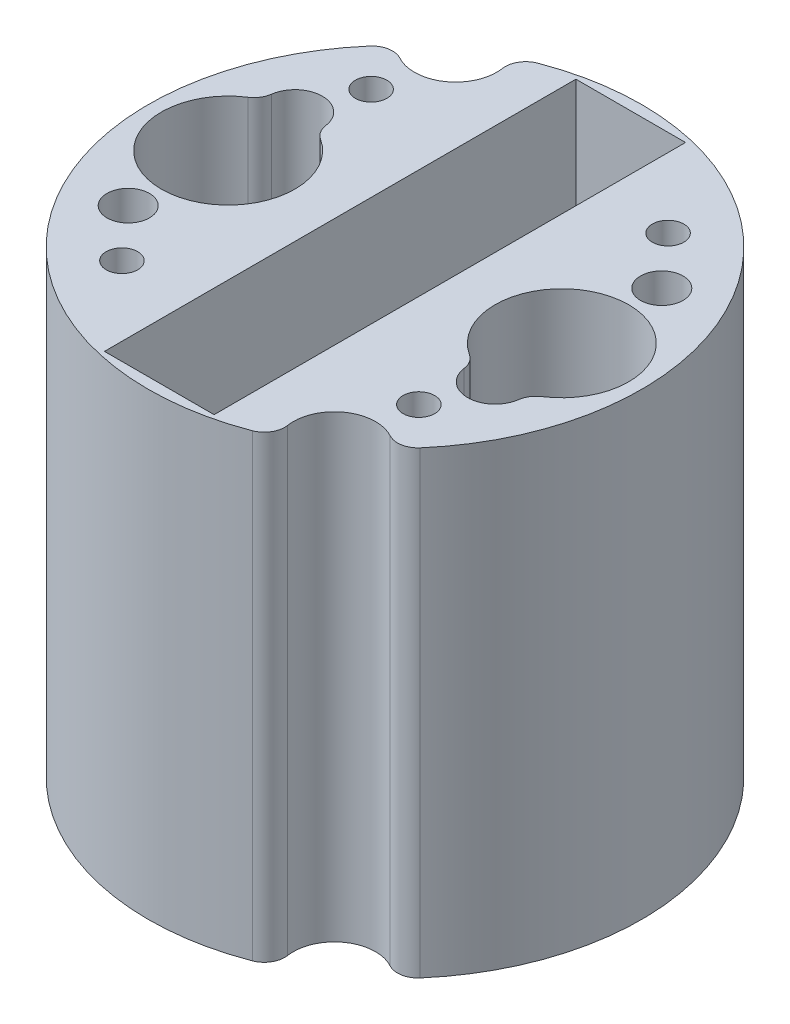
ISO-10303-21;
HEADER;
FILE_DESCRIPTION(('STEP AP214'),'2;1');
FILE_NAME('part.step','',(''),(''),'','','');
FILE_SCHEMA(('AUTOMOTIVE_DESIGN { 1 0 10303 214 1 1 1 1 }'));
ENDSEC;
DATA;
#1=APPLICATION_CONTEXT('core data for automotive mechanical design processes');
#2=APPLICATION_PROTOCOL_DEFINITION('international standard','automotive_design',2000,#1);
#3=PRODUCT_CONTEXT('',#1,'mechanical');
#4=PRODUCT('Part','Part','',(#3));
#5=PRODUCT_RELATED_PRODUCT_CATEGORY('part','',(#4));
#6=PRODUCT_DEFINITION_FORMATION('','',#4);
#7=PRODUCT_DEFINITION_CONTEXT('part definition',#1,'design');
#8=PRODUCT_DEFINITION('design','',#6,#7);
#9=PRODUCT_DEFINITION_SHAPE('','',#8);
#10=(LENGTH_UNIT() NAMED_UNIT(*) SI_UNIT(.MILLI.,.METRE.));
#11=(NAMED_UNIT(*) PLANE_ANGLE_UNIT() SI_UNIT($,.RADIAN.));
#12=(NAMED_UNIT(*) SI_UNIT($,.STERADIAN.) SOLID_ANGLE_UNIT());
#13=UNCERTAINTY_MEASURE_WITH_UNIT(LENGTH_MEASURE(1.E-05),#10,'distance_accuracy_value','');
#14=(GEOMETRIC_REPRESENTATION_CONTEXT(3) GLOBAL_UNCERTAINTY_ASSIGNED_CONTEXT((#13)) GLOBAL_UNIT_ASSIGNED_CONTEXT((#10,
#11,#12)) REPRESENTATION_CONTEXT('',''));
#15=CARTESIAN_POINT('',(0.,0.,0.));
#16=DIRECTION('',(0.,0.,1.));
#17=DIRECTION('',(1.,0.,0.));
#18=AXIS2_PLACEMENT_3D('',#15,#16,#17);
#19=CARTESIAN_POINT('',(0.,64.,0.));
#20=DIRECTION('',(0.,-1.,0.));
#21=DIRECTION('',(0.,0.,-1.));
#22=AXIS2_PLACEMENT_3D('',#19,#20,#21);
#23=CYLINDRICAL_SURFACE('',#22,36.);
#24=CARTESIAN_POINT('',(0.,-3.,0.));
#25=DIRECTION('',(0.,-1.,0.));
#26=DIRECTION('',(0.,0.,-1.));
#27=AXIS2_PLACEMENT_3D('',#24,#25,#26);
#28=CIRCLE('',#27,36.);
#29=CARTESIAN_POINT('',(12.8184338695961,-3.,33.6405670750478));
#30=VERTEX_POINT('',#29);
#31=CARTESIAN_POINT('',(-27.2276300501857,-3.,-23.5511392898566));
#32=VERTEX_POINT('',#31);
#33=EDGE_CURVE('E296',#30,#32,#28,.T.);
#34=ORIENTED_EDGE('',*,*,#33,.F.);
#35=DIRECTION('',(0.,-1.,0.));
#36=VECTOR('',#35,1.);
#37=CARTESIAN_POINT('',(12.8184338695961,64.,33.6405670750478));
#38=LINE('',#37,#36);
#39=CARTESIAN_POINT('',(12.8184338695961,64.,33.6405670750478));
#40=VERTEX_POINT('',#39);
#41=EDGE_CURVE('E11',#30,#40,#38,.F.);
#42=ORIENTED_EDGE('',*,*,#41,.T.);
#43=CARTESIAN_POINT('',(0.,64.,0.));
#44=DIRECTION('',(0.,1.,0.));
#45=DIRECTION('',(0.,0.,1.));
#46=AXIS2_PLACEMENT_3D('',#43,#44,#45);
#47=CIRCLE('',#46,36.);
#48=CARTESIAN_POINT('',(-27.2276300501857,64.,-23.5511392898566));
#49=VERTEX_POINT('',#48);
#50=EDGE_CURVE('E191',#49,#40,#47,.T.);
#51=ORIENTED_EDGE('',*,*,#50,.F.);
#52=DIRECTION('',(0.,-1.,0.));
#53=VECTOR('',#52,1.);
#54=CARTESIAN_POINT('',(-27.2276300501857,64.,-23.5511392898566));
#55=LINE('',#54,#53);
#56=EDGE_CURVE('E350',#49,#32,#55,.T.);
#57=ORIENTED_EDGE('',*,*,#56,.T.);
#58=EDGE_LOOP('',(#34,#42,#51,#57));
#59=FACE_BOUND('',#58,.T.);
#60=ADVANCED_FACE('F41',(#59),#23,.T.);
#61=CARTESIAN_POINT('',(11.7502310471298,-3.,30.8371864854605));
#62=DIRECTION('',(0.,-1.,0.));
#63=DIRECTION('',(0.,0.,1.));
#64=AXIS2_PLACEMENT_3D('',#61,#62,#63);
#65=CYLINDRICAL_SURFACE('',#64,3.);
#66=CARTESIAN_POINT('',(11.7502310471298,-3.,30.8371864854605));
#67=DIRECTION('',(0.,-1.,0.));
#68=DIRECTION('',(0.,0.,1.));
#69=AXIS2_PLACEMENT_3D('',#66,#67,#68);
#70=CIRCLE('',#69,3.);
#71=CARTESIAN_POINT('',(14.7164046009657,-3.,30.3879488551083));
#72=VERTEX_POINT('',#71);
#73=EDGE_CURVE('E388',#72,#30,#70,.T.);
#74=ORIENTED_EDGE('',*,*,#73,.F.);
#75=DIRECTION('',(0.,1.,0.));
#76=VECTOR('',#75,1.);
#77=CARTESIAN_POINT('',(14.7164046009657,-3.,30.3879488551083));
#78=LINE('',#77,#76);
#79=CARTESIAN_POINT('',(14.7164046009657,64.,30.3879488551083));
#80=VERTEX_POINT('',#79);
#81=EDGE_CURVE('E371',#80,#72,#78,.F.);
#82=ORIENTED_EDGE('',*,*,#81,.F.);
#83=CARTESIAN_POINT('',(11.7502310471298,64.,30.8371864854605));
#84=DIRECTION('',(0.,1.,0.));
#85=DIRECTION('',(0.,0.,-1.));
#86=AXIS2_PLACEMENT_3D('',#83,#84,#85);
#87=CIRCLE('',#86,3.);
#88=EDGE_CURVE('E49',#40,#80,#87,.T.);
#89=ORIENTED_EDGE('',*,*,#88,.F.);
#90=ORIENTED_EDGE('',*,*,#41,.F.);
#91=EDGE_LOOP('',(#74,#82,#89,#90));
#92=FACE_BOUND('',#91,.T.);
#93=ADVANCED_FACE('F43',(#92),#65,.T.);
#94=CARTESIAN_POINT('',(24.9586608793369,64.,21.5885443490352));
#95=DIRECTION('',(0.,-1.,0.));
#96=DIRECTION('',(0.,0.,1.));
#97=AXIS2_PLACEMENT_3D('',#94,#95,#96);
#98=CYLINDRICAL_SURFACE('',#97,3.);
#99=CARTESIAN_POINT('',(24.9586608793369,-3.,21.5885443490352));
#100=DIRECTION('',(0.,-1.,0.));
#101=DIRECTION('',(0.,0.,1.));
#102=AXIS2_PLACEMENT_3D('',#99,#100,#101);
#103=CIRCLE('',#102,3.);
#104=CARTESIAN_POINT('',(27.2276300501857,-3.,23.5511392898566));
#105=VERTEX_POINT('',#104);
#106=CARTESIAN_POINT('',(23.5220244891038,-3.,24.2221874308247));
#107=VERTEX_POINT('',#106);
#108=EDGE_CURVE('E379',#105,#107,#103,.T.);
#109=ORIENTED_EDGE('',*,*,#108,.F.);
#110=DIRECTION('',(0.,-1.,0.));
#111=VECTOR('',#110,1.);
#112=CARTESIAN_POINT('',(27.2276300501857,64.,23.5511392898566));
#113=LINE('',#112,#111);
#114=CARTESIAN_POINT('',(27.2276300501857,64.,23.5511392898566));
#115=VERTEX_POINT('',#114);
#116=EDGE_CURVE('E382',#115,#105,#113,.T.);
#117=ORIENTED_EDGE('',*,*,#116,.F.);
#118=CARTESIAN_POINT('',(24.9586608793369,64.,21.5885443490352));
#119=DIRECTION('',(0.,1.,0.));
#120=DIRECTION('',(0.,0.,-1.));
#121=AXIS2_PLACEMENT_3D('',#118,#119,#120);
#122=CIRCLE('',#121,3.);
#123=CARTESIAN_POINT('',(23.5220244891038,64.,24.2221874308247));
#124=VERTEX_POINT('',#123);
#125=EDGE_CURVE('E385',#124,#115,#122,.T.);
#126=ORIENTED_EDGE('',*,*,#125,.F.);
#127=DIRECTION('',(0.,1.,0.));
#128=VECTOR('',#127,1.);
#129=CARTESIAN_POINT('',(23.5220244891038,-3.,24.2221874308247));
#130=LINE('',#129,#128);
#131=EDGE_CURVE('E376',#107,#124,#130,.T.);
#132=ORIENTED_EDGE('',*,*,#131,.F.);
#133=EDGE_LOOP('',(#109,#117,#126,#132));
#134=FACE_BOUND('',#133,.T.);
#135=ADVANCED_FACE('F412',(#134),#98,.T.);
#136=CARTESIAN_POINT('',(20.6487517086375,-3.,29.4894735944038));
#137=DIRECTION('',(0.,1.,0.));
#138=DIRECTION('',(0.,0.,-1.));
#139=AXIS2_PLACEMENT_3D('',#136,#137,#138);
#140=CYLINDRICAL_SURFACE('',#139,6.);
#141=CARTESIAN_POINT('',(20.6487517086375,64.,29.4894735944038));
#142=DIRECTION('',(0.,1.,0.));
#143=DIRECTION('',(0.,0.,-1.));
#144=AXIS2_PLACEMENT_3D('',#141,#142,#143);
#145=CIRCLE('',#144,6.);
#146=EDGE_CURVE('E369',#124,#80,#145,.T.);
#147=ORIENTED_EDGE('',*,*,#146,.T.);
#148=ORIENTED_EDGE('',*,*,#81,.T.);
#149=CARTESIAN_POINT('',(20.6487517086375,-3.,29.4894735944038));
#150=DIRECTION('',(0.,1.,0.));
#151=DIRECTION('',(0.,0.,-1.));
#152=AXIS2_PLACEMENT_3D('',#149,#150,#151);
#153=CIRCLE('',#152,6.);
#154=EDGE_CURVE('E373',#107,#72,#153,.T.);
#155=ORIENTED_EDGE('',*,*,#154,.F.);
#156=ORIENTED_EDGE('',*,*,#131,.T.);
#157=EDGE_LOOP('',(#147,#148,#155,#156));
#158=FACE_BOUND('',#157,.T.);
#159=ADVANCED_FACE('F409',(#158),#140,.F.);
#160=CARTESIAN_POINT('',(0.,64.,0.));
#161=DIRECTION('',(0.,1.,0.));
#162=DIRECTION('',(0.,0.,1.));
#163=AXIS2_PLACEMENT_3D('',#160,#161,#162);
#164=PLANE('',#163);
#165=ORIENTED_EDGE('',*,*,#50,.T.);
#166=ORIENTED_EDGE('',*,*,#88,.T.);
#167=ORIENTED_EDGE('',*,*,#146,.F.);
#168=ORIENTED_EDGE('',*,*,#125,.T.);
#169=CARTESIAN_POINT('',(-12.8184338695961,64.,-33.6405670750478));
#170=VERTEX_POINT('',#169);
#171=EDGE_CURVE('E317',#115,#170,#47,.T.);
#172=ORIENTED_EDGE('',*,*,#171,.T.);
#173=CARTESIAN_POINT('',(-11.7502310471298,64.,-30.8371864854605));
#174=DIRECTION('',(0.,1.,0.));
#175=DIRECTION('',(0.,0.,1.));
#176=AXIS2_PLACEMENT_3D('',#173,#174,#175);
#177=CIRCLE('',#176,3.);
#178=CARTESIAN_POINT('',(-14.7164046009657,64.,-30.3879488551083));
#179=VERTEX_POINT('',#178);
#180=EDGE_CURVE('E330',#170,#179,#177,.T.);
#181=ORIENTED_EDGE('',*,*,#180,.T.);
#182=CARTESIAN_POINT('',(-20.6487517086375,64.,-29.4894735944038));
#183=DIRECTION('',(0.,1.,0.));
#184=DIRECTION('',(0.,0.,1.));
#185=AXIS2_PLACEMENT_3D('',#182,#183,#184);
#186=CIRCLE('',#185,6.);
#187=CARTESIAN_POINT('',(-23.5220244891038,64.,-24.2221874308247));
#188=VERTEX_POINT('',#187);
#189=EDGE_CURVE('E218',#188,#179,#186,.T.);
#190=ORIENTED_EDGE('',*,*,#189,.F.);
#191=CARTESIAN_POINT('',(-24.9586608793369,64.,-21.5885443490352));
#192=DIRECTION('',(0.,1.,0.));
#193=DIRECTION('',(0.,0.,1.));
#194=AXIS2_PLACEMENT_3D('',#191,#192,#193);
#195=CIRCLE('',#194,3.);
#196=EDGE_CURVE('E328',#188,#49,#195,.T.);
#197=ORIENTED_EDGE('',*,*,#196,.T.);
#198=EDGE_LOOP('',(#165,#166,#167,#168,#172,#181,#190,#197));
#199=FACE_BOUND('',#198,.T.);
#200=CARTESIAN_POINT('',(-24.6817240078565,64.,14.25));
#201=DIRECTION('',(0.,1.,0.));
#202=DIRECTION('',(0.,0.,1.));
#203=AXIS2_PLACEMENT_3D('',#200,#201,#202);
#204=CIRCLE('',#203,3.1);
#205=CARTESIAN_POINT('',(-24.6817240078565,64.,17.35));
#206=VERTEX_POINT('',#205);
#207=EDGE_CURVE('E233',#206,#206,#204,.T.);
#208=ORIENTED_EDGE('',*,*,#207,.F.);
#209=EDGE_LOOP('',(#208));
#210=FACE_BOUND('',#209,.T.);
#211=CARTESIAN_POINT('',(24.6817240078565,64.,-14.25));
#212=DIRECTION('',(0.,1.,0.));
#213=DIRECTION('',(0.,0.,1.));
#214=AXIS2_PLACEMENT_3D('',#211,#212,#213);
#215=CIRCLE('',#214,3.1);
#216=CARTESIAN_POINT('',(24.6817240078565,64.,-11.15));
#217=VERTEX_POINT('',#216);
#218=EDGE_CURVE('E228',#217,#217,#215,.T.);
#219=ORIENTED_EDGE('',*,*,#218,.F.);
#220=EDGE_LOOP('',(#219));
#221=FACE_BOUND('',#220,.T.);
#222=CARTESIAN_POINT('',(-18.1807791068817,64.,21.6670088167882));
#223=DIRECTION('',(0.,1.,0.));
#224=DIRECTION('',(0.,0.,1.));
#225=AXIS2_PLACEMENT_3D('',#222,#223,#224);
#226=CIRCLE('',#225,2.3);
#227=CARTESIAN_POINT('',(-18.1807791068817,64.,23.9670088167882));
#228=VERTEX_POINT('',#227);
#229=EDGE_CURVE('E259',#228,#228,#226,.T.);
#230=ORIENTED_EDGE('',*,*,#229,.F.);
#231=EDGE_LOOP('',(#230));
#232=FACE_BOUND('',#231,.T.);
#233=CARTESIAN_POINT('',(21.6670088167881,64.,18.1807791068817));
#234=DIRECTION('',(0.,1.,0.));
#235=DIRECTION('',(0.,0.,1.));
#236=AXIS2_PLACEMENT_3D('',#233,#234,#235);
#237=CIRCLE('',#236,2.3);
#238=CARTESIAN_POINT('',(21.6670088167881,64.,20.4807791068817));
#239=VERTEX_POINT('',#238);
#240=EDGE_CURVE('E251',#239,#239,#237,.T.);
#241=ORIENTED_EDGE('',*,*,#240,.F.);
#242=EDGE_LOOP('',(#241));
#243=FACE_BOUND('',#242,.T.);
#244=CARTESIAN_POINT('',(18.1807791068817,64.,-21.6670088167881));
#245=DIRECTION('',(0.,1.,0.));
#246=DIRECTION('',(0.,0.,1.));
#247=AXIS2_PLACEMENT_3D('',#244,#245,#246);
#248=CIRCLE('',#247,2.3);
#249=CARTESIAN_POINT('',(18.1807791068817,64.,-19.3670088167881));
#250=VERTEX_POINT('',#249);
#251=EDGE_CURVE('E240',#250,#250,#248,.T.);
#252=ORIENTED_EDGE('',*,*,#251,.F.);
#253=EDGE_LOOP('',(#252));
#254=FACE_BOUND('',#253,.T.);
#255=CARTESIAN_POINT('',(-21.6670088167882,64.,-18.1807791068817));
#256=DIRECTION('',(0.,1.,0.));
#257=DIRECTION('',(0.,0.,1.));
#258=AXIS2_PLACEMENT_3D('',#255,#256,#257);
#259=CIRCLE('',#258,2.3);
#260=CARTESIAN_POINT('',(-21.6670088167882,64.,-15.8807791068817));
#261=VERTEX_POINT('',#260);
#262=EDGE_CURVE('E266',#261,#261,#259,.T.);
#263=ORIENTED_EDGE('',*,*,#262,.F.);
#264=EDGE_LOOP('',(#263));
#265=FACE_BOUND('',#264,.T.);
#266=CARTESIAN_POINT('',(-24.35,64.,-9.75));
#267=DIRECTION('',(0.,1.,0.));
#268=DIRECTION('',(0.,0.,1.));
#269=AXIS2_PLACEMENT_3D('',#266,#267,#268);
#270=CIRCLE('',#269,4.);
#271=CARTESIAN_POINT('',(-20.3869076492181,64.,-10.2921245421245));
#272=VERTEX_POINT('',#271);
#273=CARTESIAN_POINT('',(-28.3130923507819,64.,-10.2921245421245));
#274=VERTEX_POINT('',#273);
#275=EDGE_CURVE('E285',#272,#274,#270,.T.);
#276=ORIENTED_EDGE('',*,*,#275,.F.);
#277=CARTESIAN_POINT('',(-17.4145883861316,64.,-10.6987179487179));
#278=DIRECTION('',(0.,1.,0.));
#279=DIRECTION('',(0.,0.,1.));
#280=AXIS2_PLACEMENT_3D('',#277,#278,#279);
#281=CIRCLE('',#280,3.);
#282=CARTESIAN_POINT('',(-19.0464499423359,64.,-8.1813725490196));
#283=VERTEX_POINT('',#282);
#284=EDGE_CURVE('E334',#272,#283,#281,.T.);
#285=ORIENTED_EDGE('',*,*,#284,.T.);
#286=CARTESIAN_POINT('',(-24.35,64.,0.));
#287=DIRECTION('',(0.,1.,0.));
#288=DIRECTION('',(0.,0.,1.));
#289=AXIS2_PLACEMENT_3D('',#286,#287,#288);
#290=CIRCLE('',#289,9.75);
#291=CARTESIAN_POINT('',(-29.6535500576641,64.,-8.1813725490196));
#292=VERTEX_POINT('',#291);
#293=EDGE_CURVE('E299',#292,#283,#290,.T.);
#294=ORIENTED_EDGE('',*,*,#293,.F.);
#295=CARTESIAN_POINT('',(-31.2854116138684,64.,-10.6987179487179));
#296=DIRECTION('',(0.,1.,0.));
#297=DIRECTION('',(0.,0.,1.));
#298=AXIS2_PLACEMENT_3D('',#295,#296,#297);
#299=CIRCLE('',#298,3.);
#300=EDGE_CURVE('E332',#292,#274,#299,.T.);
#301=ORIENTED_EDGE('',*,*,#300,.T.);
#302=EDGE_LOOP('',(#276,#285,#294,#301));
#303=FACE_BOUND('',#302,.T.);
#304=CARTESIAN_POINT('',(24.35,64.,0.));
#305=DIRECTION('',(0.,1.,0.));
#306=DIRECTION('',(0.,0.,1.));
#307=AXIS2_PLACEMENT_3D('',#304,#305,#306);
#308=CIRCLE('',#307,9.75);
#309=CARTESIAN_POINT('',(29.6535500576641,64.,8.1813725490196));
#310=VERTEX_POINT('',#309);
#311=CARTESIAN_POINT('',(19.0464499423359,64.,8.1813725490196));
#312=VERTEX_POINT('',#311);
#313=EDGE_CURVE('E295',#310,#312,#308,.T.);
#314=ORIENTED_EDGE('',*,*,#313,.F.);
#315=CARTESIAN_POINT('',(31.2854116138684,64.,10.6987179487179));
#316=DIRECTION('',(0.,1.,0.));
#317=DIRECTION('',(0.,0.,1.));
#318=AXIS2_PLACEMENT_3D('',#315,#316,#317);
#319=CIRCLE('',#318,3.);
#320=CARTESIAN_POINT('',(28.3130923507819,64.,10.2921245421245));
#321=VERTEX_POINT('',#320);
#322=EDGE_CURVE('E338',#310,#321,#319,.T.);
#323=ORIENTED_EDGE('',*,*,#322,.T.);
#324=CARTESIAN_POINT('',(24.35,64.,9.75));
#325=DIRECTION('',(0.,1.,0.));
#326=DIRECTION('',(0.,0.,1.));
#327=AXIS2_PLACEMENT_3D('',#324,#325,#326);
#328=CIRCLE('',#327,4.);
#329=CARTESIAN_POINT('',(20.3869076492181,64.,10.2921245421245));
#330=VERTEX_POINT('',#329);
#331=EDGE_CURVE('E276',#330,#321,#328,.T.);
#332=ORIENTED_EDGE('',*,*,#331,.F.);
#333=CARTESIAN_POINT('',(17.4145883861316,64.,10.6987179487179));
#334=DIRECTION('',(0.,1.,0.));
#335=DIRECTION('',(0.,0.,1.));
#336=AXIS2_PLACEMENT_3D('',#333,#334,#335);
#337=CIRCLE('',#336,3.);
#338=EDGE_CURVE('E336',#330,#312,#337,.T.);
#339=ORIENTED_EDGE('',*,*,#338,.T.);
#340=EDGE_LOOP('',(#314,#323,#332,#339));
#341=FACE_BOUND('',#340,.T.);
#342=DIRECTION('',(1.,0.,0.));
#343=VECTOR('',#342,1.);
#344=CARTESIAN_POINT('',(-8.,64.,34.4));
#345=LINE('',#344,#343);
#346=CARTESIAN_POINT('',(-8.,64.,34.4));
#347=VERTEX_POINT('',#346);
#348=CARTESIAN_POINT('',(8.,64.,34.4));
#349=VERTEX_POINT('',#348);
#350=EDGE_CURVE('E303',#347,#349,#345,.T.);
#351=ORIENTED_EDGE('',*,*,#350,.F.);
#352=DIRECTION('',(0.,0.,1.));
#353=VECTOR('',#352,1.);
#354=CARTESIAN_POINT('',(-8.,64.,-34.4));
#355=LINE('',#354,#353);
#356=CARTESIAN_POINT('',(-8.,64.,-34.4));
#357=VERTEX_POINT('',#356);
#358=EDGE_CURVE('E188',#357,#347,#355,.T.);
#359=ORIENTED_EDGE('',*,*,#358,.F.);
#360=DIRECTION('',(-1.,0.,0.));
#361=VECTOR('',#360,1.);
#362=CARTESIAN_POINT('',(-8.,64.,-34.4));
#363=LINE('',#362,#361);
#364=CARTESIAN_POINT('',(8.,64.,-34.4));
#365=VERTEX_POINT('',#364);
#366=EDGE_CURVE('E308',#365,#357,#363,.T.);
#367=ORIENTED_EDGE('',*,*,#366,.F.);
#368=DIRECTION('',(0.,0.,-1.));
#369=VECTOR('',#368,1.);
#370=CARTESIAN_POINT('',(8.,64.,-34.4));
#371=LINE('',#370,#369);
#372=EDGE_CURVE('E305',#349,#365,#371,.T.);
#373=ORIENTED_EDGE('',*,*,#372,.F.);
#374=EDGE_LOOP('',(#351,#359,#367,#373));
#375=FACE_BOUND('',#374,.T.);
#376=ADVANCED_FACE('F393',(#199,#210,#221,#232,#243,#254,#265,#303,#341,#375),#164,.T.);
#377=CARTESIAN_POINT('',(-12.8184338695961,-3.,-33.6405670750478));
#378=VERTEX_POINT('',#377);
#379=EDGE_CURVE('E291',#378,#105,#28,.T.);
#380=ORIENTED_EDGE('',*,*,#379,.F.);
#381=DIRECTION('',(0.,-1.,0.));
#382=VECTOR('',#381,1.);
#383=CARTESIAN_POINT('',(-12.8184338695961,64.,-33.6405670750478));
#384=LINE('',#383,#382);
#385=EDGE_CURVE('E353',#378,#170,#384,.F.);
#386=ORIENTED_EDGE('',*,*,#385,.T.);
#387=ORIENTED_EDGE('',*,*,#171,.F.);
#388=ORIENTED_EDGE('',*,*,#116,.T.);
#389=EDGE_LOOP('',(#380,#386,#387,#388));
#390=FACE_BOUND('',#389,.T.);
#391=ADVANCED_FACE('F423',(#390),#23,.T.);
#392=CARTESIAN_POINT('',(-8.,64.,-34.4));
#393=DIRECTION('',(1.,0.,0.));
#394=DIRECTION('',(0.,0.,-1.));
#395=AXIS2_PLACEMENT_3D('',#392,#393,#394);
#396=PLANE('',#395);
#397=DIRECTION('',(0.,-1.,0.));
#398=VECTOR('',#397,1.);
#399=CARTESIAN_POINT('',(-8.,64.,34.4));
#400=LINE('',#399,#398);
#401=CARTESIAN_POINT('',(-8.,-2.5,34.4));
#402=VERTEX_POINT('',#401);
#403=EDGE_CURVE('E180',#347,#402,#400,.T.);
#404=ORIENTED_EDGE('',*,*,#403,.T.);
#405=DIRECTION('',(0.,0.,1.));
#406=VECTOR('',#405,1.);
#407=CARTESIAN_POINT('',(-8.,-2.5,34.4));
#408=LINE('',#407,#406);
#409=CARTESIAN_POINT('',(-8.,-2.5,-34.4));
#410=VERTEX_POINT('',#409);
#411=EDGE_CURVE('E185',#410,#402,#408,.T.);
#412=ORIENTED_EDGE('',*,*,#411,.F.);
#413=DIRECTION('',(0.,-1.,0.));
#414=VECTOR('',#413,1.);
#415=CARTESIAN_POINT('',(-8.,64.,-34.4));
#416=LINE('',#415,#414);
#417=EDGE_CURVE('E310',#357,#410,#416,.T.);
#418=ORIENTED_EDGE('',*,*,#417,.F.);
#419=ORIENTED_EDGE('',*,*,#358,.T.);
#420=EDGE_LOOP('',(#404,#412,#418,#419));
#421=FACE_BOUND('',#420,.T.);
#422=ADVANCED_FACE('F182',(#421),#396,.T.);
#423=CARTESIAN_POINT('',(-8.,64.,34.4));
#424=DIRECTION('',(0.,0.,-1.));
#425=DIRECTION('',(-1.,0.,0.));
#426=AXIS2_PLACEMENT_3D('',#423,#424,#425);
#427=PLANE('',#426);
#428=DIRECTION('',(0.,-1.,0.));
#429=VECTOR('',#428,1.);
#430=CARTESIAN_POINT('',(8.,64.,34.4));
#431=LINE('',#430,#429);
#432=CARTESIAN_POINT('',(8.,-2.5,34.4));
#433=VERTEX_POINT('',#432);
#434=EDGE_CURVE('E192',#349,#433,#431,.T.);
#435=ORIENTED_EDGE('',*,*,#434,.T.);
#436=DIRECTION('',(1.,0.,0.));
#437=VECTOR('',#436,1.);
#438=CARTESIAN_POINT('',(8.,-2.5,34.4));
#439=LINE('',#438,#437);
#440=EDGE_CURVE('E195',#402,#433,#439,.T.);
#441=ORIENTED_EDGE('',*,*,#440,.F.);
#442=ORIENTED_EDGE('',*,*,#403,.F.);
#443=ORIENTED_EDGE('',*,*,#350,.T.);
#444=EDGE_LOOP('',(#435,#441,#442,#443));
#445=FACE_BOUND('',#444,.T.);
#446=ADVANCED_FACE('F196',(#445),#427,.T.);
#447=CARTESIAN_POINT('',(8.,64.,-34.4));
#448=DIRECTION('',(-1.,0.,0.));
#449=DIRECTION('',(0.,0.,1.));
#450=AXIS2_PLACEMENT_3D('',#447,#448,#449);
#451=PLANE('',#450);
#452=DIRECTION('',(0.,-1.,0.));
#453=VECTOR('',#452,1.);
#454=CARTESIAN_POINT('',(8.,64.,-34.4));
#455=LINE('',#454,#453);
#456=CARTESIAN_POINT('',(8.,-2.5,-34.4));
#457=VERTEX_POINT('',#456);
#458=EDGE_CURVE('E312',#365,#457,#455,.T.);
#459=ORIENTED_EDGE('',*,*,#458,.T.);
#460=DIRECTION('',(0.,0.,-1.));
#461=VECTOR('',#460,1.);
#462=CARTESIAN_POINT('',(8.,-2.5,-34.4));
#463=LINE('',#462,#461);
#464=EDGE_CURVE('E201',#433,#457,#463,.T.);
#465=ORIENTED_EDGE('',*,*,#464,.F.);
#466=ORIENTED_EDGE('',*,*,#434,.F.);
#467=ORIENTED_EDGE('',*,*,#372,.T.);
#468=EDGE_LOOP('',(#459,#465,#466,#467));
#469=FACE_BOUND('',#468,.T.);
#470=ADVANCED_FACE('F461',(#469),#451,.T.);
#471=CARTESIAN_POINT('',(-8.,64.,-34.4));
#472=DIRECTION('',(0.,0.,1.));
#473=DIRECTION('',(1.,0.,0.));
#474=AXIS2_PLACEMENT_3D('',#471,#472,#473);
#475=PLANE('',#474);
#476=ORIENTED_EDGE('',*,*,#417,.T.);
#477=DIRECTION('',(-1.,0.,0.));
#478=VECTOR('',#477,1.);
#479=CARTESIAN_POINT('',(-8.,-2.5,-34.4));
#480=LINE('',#479,#478);
#481=EDGE_CURVE('E205',#457,#410,#480,.T.);
#482=ORIENTED_EDGE('',*,*,#481,.F.);
#483=ORIENTED_EDGE('',*,*,#458,.F.);
#484=ORIENTED_EDGE('',*,*,#366,.T.);
#485=EDGE_LOOP('',(#476,#482,#483,#484));
#486=FACE_BOUND('',#485,.T.);
#487=ADVANCED_FACE('F464',(#486),#475,.T.);
#488=CARTESIAN_POINT('',(-24.35,64.,0.));
#489=DIRECTION('',(0.,-1.,0.));
#490=DIRECTION('',(0.,0.,-1.));
#491=AXIS2_PLACEMENT_3D('',#488,#489,#490);
#492=CYLINDRICAL_SURFACE('',#491,9.75);
#493=ORIENTED_EDGE('',*,*,#293,.T.);
#494=DIRECTION('',(0.,-1.,0.));
#495=VECTOR('',#494,1.);
#496=CARTESIAN_POINT('',(-19.0464499423359,64.,-8.18137254901961));
#497=LINE('',#496,#495);
#498=CARTESIAN_POINT('',(-19.0464499423359,12.,-8.1813725490196));
#499=VERTEX_POINT('',#498);
#500=EDGE_CURVE('E348',#283,#499,#497,.T.);
#501=ORIENTED_EDGE('',*,*,#500,.T.);
#502=CARTESIAN_POINT('',(-24.35,12.,0.));
#503=DIRECTION('',(0.,1.,0.));
#504=DIRECTION('',(0.,0.,1.));
#505=AXIS2_PLACEMENT_3D('',#502,#503,#504);
#506=CIRCLE('',#505,9.75);
#507=CARTESIAN_POINT('',(-29.6535500576641,12.,-8.1813725490196));
#508=VERTEX_POINT('',#507);
#509=EDGE_CURVE('E316',#508,#499,#506,.T.);
#510=ORIENTED_EDGE('',*,*,#509,.F.);
#511=DIRECTION('',(0.,-1.,0.));
#512=VECTOR('',#511,1.);
#513=CARTESIAN_POINT('',(-29.6535500576641,64.,-8.18137254901961));
#514=LINE('',#513,#512);
#515=EDGE_CURVE('E346',#508,#292,#514,.F.);
#516=ORIENTED_EDGE('',*,*,#515,.T.);
#517=EDGE_LOOP('',(#493,#501,#510,#516));
#518=FACE_BOUND('',#517,.T.);
#519=ADVANCED_FACE('F468',(#518),#492,.F.);
#520=CARTESIAN_POINT('',(24.35,64.,0.));
#521=DIRECTION('',(0.,-1.,0.));
#522=DIRECTION('',(0.,0.,-1.));
#523=AXIS2_PLACEMENT_3D('',#520,#521,#522);
#524=CYLINDRICAL_SURFACE('',#523,9.75);
#525=CARTESIAN_POINT('',(24.35,16.,0.));
#526=DIRECTION('',(0.,1.,0.));
#527=DIRECTION('',(0.,0.,1.));
#528=AXIS2_PLACEMENT_3D('',#525,#526,#527);
#529=CIRCLE('',#528,9.75);
#530=CARTESIAN_POINT('',(29.6535500576641,16.,8.1813725490196));
#531=VERTEX_POINT('',#530);
#532=CARTESIAN_POINT('',(19.0464499423359,16.,8.1813725490196));
#533=VERTEX_POINT('',#532);
#534=EDGE_CURVE('E64',#531,#533,#529,.T.);
#535=ORIENTED_EDGE('',*,*,#534,.F.);
#536=DIRECTION('',(0.,-1.,0.));
#537=VECTOR('',#536,1.);
#538=CARTESIAN_POINT('',(29.6535500576641,64.,8.1813725490196));
#539=LINE('',#538,#537);
#540=EDGE_CURVE('E326',#531,#310,#539,.F.);
#541=ORIENTED_EDGE('',*,*,#540,.T.);
#542=ORIENTED_EDGE('',*,*,#313,.T.);
#543=DIRECTION('',(0.,-1.,0.));
#544=VECTOR('',#543,1.);
#545=CARTESIAN_POINT('',(19.0464499423359,64.,8.1813725490196));
#546=LINE('',#545,#544);
#547=EDGE_CURVE('E324',#312,#533,#546,.T.);
#548=ORIENTED_EDGE('',*,*,#547,.T.);
#549=EDGE_LOOP('',(#535,#541,#542,#548));
#550=FACE_BOUND('',#549,.T.);
#551=ADVANCED_FACE('F472',(#550),#524,.F.);
#552=CARTESIAN_POINT('',(0.,-3.,0.));
#553=DIRECTION('',(0.,-1.,0.));
#554=DIRECTION('',(0.,0.,-1.));
#555=AXIS2_PLACEMENT_3D('',#552,#553,#554);
#556=PLANE('',#555);
#557=ORIENTED_EDGE('',*,*,#379,.T.);
#558=ORIENTED_EDGE('',*,*,#108,.T.);
#559=ORIENTED_EDGE('',*,*,#154,.T.);
#560=ORIENTED_EDGE('',*,*,#73,.T.);
#561=ORIENTED_EDGE('',*,*,#33,.T.);
#562=CARTESIAN_POINT('',(-24.9586608793369,-3.,-21.5885443490352));
#563=DIRECTION('',(0.,-1.,0.));
#564=DIRECTION('',(0.,0.,-1.));
#565=AXIS2_PLACEMENT_3D('',#562,#563,#564);
#566=CIRCLE('',#565,3.);
#567=CARTESIAN_POINT('',(-23.5220244891038,-3.,-24.2221874308247));
#568=VERTEX_POINT('',#567);
#569=EDGE_CURVE('E361',#32,#568,#566,.T.);
#570=ORIENTED_EDGE('',*,*,#569,.T.);
#571=CARTESIAN_POINT('',(-20.6487517086375,-3.,-29.4894735944038));
#572=DIRECTION('',(0.,1.,0.));
#573=DIRECTION('',(0.,0.,1.));
#574=AXIS2_PLACEMENT_3D('',#571,#572,#573);
#575=CIRCLE('',#574,6.);
#576=CARTESIAN_POINT('',(-14.7164046009657,-3.,-30.3879488551083));
#577=VERTEX_POINT('',#576);
#578=EDGE_CURVE('E219',#568,#577,#575,.T.);
#579=ORIENTED_EDGE('',*,*,#578,.T.);
#580=CARTESIAN_POINT('',(-11.7502310471298,-3.,-30.8371864854605));
#581=DIRECTION('',(0.,-1.,0.));
#582=DIRECTION('',(0.,0.,-1.));
#583=AXIS2_PLACEMENT_3D('',#580,#581,#582);
#584=CIRCLE('',#583,3.);
#585=EDGE_CURVE('E363',#577,#378,#584,.T.);
#586=ORIENTED_EDGE('',*,*,#585,.T.);
#587=EDGE_LOOP('',(#557,#558,#559,#560,#561,#570,#579,#586));
#588=FACE_BOUND('',#587,.T.);
#589=CARTESIAN_POINT('',(-24.6817240078565,-3.,14.25));
#590=DIRECTION('',(0.,1.,0.));
#591=DIRECTION('',(0.,0.,1.));
#592=AXIS2_PLACEMENT_3D('',#589,#590,#591);
#593=CIRCLE('',#592,3.1);
#594=CARTESIAN_POINT('',(-24.6817240078565,-3.,17.35));
#595=VERTEX_POINT('',#594);
#596=EDGE_CURVE('E225',#595,#595,#593,.T.);
#597=ORIENTED_EDGE('',*,*,#596,.T.);
#598=EDGE_LOOP('',(#597));
#599=FACE_BOUND('',#598,.T.);
#600=CARTESIAN_POINT('',(24.6817240078565,-3.,-14.25));
#601=DIRECTION('',(0.,1.,0.));
#602=DIRECTION('',(0.,0.,1.));
#603=AXIS2_PLACEMENT_3D('',#600,#601,#602);
#604=CIRCLE('',#603,3.1);
#605=CARTESIAN_POINT('',(24.6817240078565,-3.,-11.15));
#606=VERTEX_POINT('',#605);
#607=EDGE_CURVE('E222',#606,#606,#604,.T.);
#608=ORIENTED_EDGE('',*,*,#607,.T.);
#609=EDGE_LOOP('',(#608));
#610=FACE_BOUND('',#609,.T.);
#611=ADVANCED_FACE('F404',(#588,#599,#610),#556,.T.);
#612=CARTESIAN_POINT('',(0.,12.,0.));
#613=DIRECTION('',(0.,1.,0.));
#614=DIRECTION('',(0.,0.,1.));
#615=AXIS2_PLACEMENT_3D('',#612,#613,#614);
#616=PLANE('',#615);
#617=CARTESIAN_POINT('',(-24.35,12.,-9.75));
#618=DIRECTION('',(0.,1.,0.));
#619=DIRECTION('',(0.,0.,1.));
#620=AXIS2_PLACEMENT_3D('',#617,#618,#619);
#621=CIRCLE('',#620,4.);
#622=CARTESIAN_POINT('',(-28.3130923507819,12.,-10.2921245421245));
#623=VERTEX_POINT('',#622);
#624=CARTESIAN_POINT('',(-20.3869076492181,12.,-10.2921245421245));
#625=VERTEX_POINT('',#624);
#626=EDGE_CURVE('E288',#623,#625,#621,.F.);
#627=ORIENTED_EDGE('',*,*,#626,.F.);
#628=CARTESIAN_POINT('',(-31.2854116138684,12.,-10.6987179487179));
#629=DIRECTION('',(0.,1.,0.));
#630=DIRECTION('',(0.,0.,1.));
#631=AXIS2_PLACEMENT_3D('',#628,#629,#630);
#632=CIRCLE('',#631,3.);
#633=EDGE_CURVE('E367',#623,#508,#632,.F.);
#634=ORIENTED_EDGE('',*,*,#633,.T.);
#635=ORIENTED_EDGE('',*,*,#509,.T.);
#636=CARTESIAN_POINT('',(-17.4145883861316,12.,-10.6987179487179));
#637=DIRECTION('',(0.,1.,0.));
#638=DIRECTION('',(0.,0.,1.));
#639=AXIS2_PLACEMENT_3D('',#636,#637,#638);
#640=CIRCLE('',#639,3.);
#641=EDGE_CURVE('E365',#499,#625,#640,.F.);
#642=ORIENTED_EDGE('',*,*,#641,.T.);
#643=EDGE_LOOP('',(#627,#634,#635,#642));
#644=FACE_BOUND('',#643,.T.);
#645=ADVANCED_FACE('F478',(#644),#616,.T.);
#646=CARTESIAN_POINT('',(24.35,0.686291501015235,9.75));
#647=DIRECTION('',(0.,1.,0.));
#648=DIRECTION('',(0.,0.,1.));
#649=AXIS2_PLACEMENT_3D('',#646,#647,#648);
#650=CYLINDRICAL_SURFACE('',#649,4.);
#651=DIRECTION('',(0.,1.,0.));
#652=VECTOR('',#651,1.);
#653=CARTESIAN_POINT('',(28.3130923507819,0.686291501015235,10.2921245421245));
#654=LINE('',#653,#652);
#655=CARTESIAN_POINT('',(28.3130923507819,16.,10.2921245421245));
#656=VERTEX_POINT('',#655);
#657=EDGE_CURVE('E322',#321,#656,#654,.F.);
#658=ORIENTED_EDGE('',*,*,#657,.T.);
#659=CARTESIAN_POINT('',(24.35,16.,9.75));
#660=DIRECTION('',(0.,1.,0.));
#661=DIRECTION('',(0.,0.,1.));
#662=AXIS2_PLACEMENT_3D('',#659,#660,#661);
#663=CIRCLE('',#662,4.);
#664=CARTESIAN_POINT('',(20.3869076492181,16.,10.2921245421245));
#665=VERTEX_POINT('',#664);
#666=EDGE_CURVE('E215',#665,#656,#663,.T.);
#667=ORIENTED_EDGE('',*,*,#666,.F.);
#668=DIRECTION('',(0.,1.,0.));
#669=VECTOR('',#668,1.);
#670=CARTESIAN_POINT('',(20.3869076492181,0.686291501015235,10.2921245421245));
#671=LINE('',#670,#669);
#672=EDGE_CURVE('E320',#665,#330,#671,.T.);
#673=ORIENTED_EDGE('',*,*,#672,.T.);
#674=ORIENTED_EDGE('',*,*,#331,.T.);
#675=EDGE_LOOP('',(#658,#667,#673,#674));
#676=FACE_BOUND('',#675,.T.);
#677=ADVANCED_FACE('F481',(#676),#650,.F.);
#678=CARTESIAN_POINT('',(-24.35,0.686291501015235,-9.75));
#679=DIRECTION('',(0.,1.,0.));
#680=DIRECTION('',(0.,0.,1.));
#681=AXIS2_PLACEMENT_3D('',#678,#679,#680);
#682=CYLINDRICAL_SURFACE('',#681,4.);
#683=ORIENTED_EDGE('',*,*,#626,.T.);
#684=DIRECTION('',(0.,1.,0.));
#685=VECTOR('',#684,1.);
#686=CARTESIAN_POINT('',(-20.3869076492181,0.686291501015235,-10.2921245421245));
#687=LINE('',#686,#685);
#688=EDGE_CURVE('E343',#625,#272,#687,.T.);
#689=ORIENTED_EDGE('',*,*,#688,.T.);
#690=ORIENTED_EDGE('',*,*,#275,.T.);
#691=DIRECTION('',(0.,1.,0.));
#692=VECTOR('',#691,1.);
#693=CARTESIAN_POINT('',(-28.3130923507819,0.686291501015235,-10.2921245421245));
#694=LINE('',#693,#692);
#695=EDGE_CURVE('E340',#274,#623,#694,.F.);
#696=ORIENTED_EDGE('',*,*,#695,.T.);
#697=EDGE_LOOP('',(#683,#689,#690,#696));
#698=FACE_BOUND('',#697,.T.);
#699=ADVANCED_FACE('F485',(#698),#682,.F.);
#700=CARTESIAN_POINT('',(-21.6670088167882,58.,-18.1807791068817));
#701=DIRECTION('',(0.,1.,0.));
#702=DIRECTION('',(0.,0.,1.));
#703=AXIS2_PLACEMENT_3D('',#700,#701,#702);
#704=CYLINDRICAL_SURFACE('',#703,2.3);
#705=CARTESIAN_POINT('',(-21.6670088167882,58.,-18.1807791068817));
#706=DIRECTION('',(0.,1.,0.));
#707=DIRECTION('',(0.,0.,1.));
#708=AXIS2_PLACEMENT_3D('',#705,#706,#707);
#709=CIRCLE('',#708,2.3);
#710=CARTESIAN_POINT('',(-21.6670088167882,58.,-15.8807791068817));
#711=VERTEX_POINT('',#710);
#712=EDGE_CURVE('E267',#711,#711,#709,.T.);
#713=ORIENTED_EDGE('',*,*,#712,.F.);
#714=EDGE_LOOP('',(#713));
#715=FACE_BOUND('',#714,.T.);
#716=ORIENTED_EDGE('',*,*,#262,.T.);
#717=EDGE_LOOP('',(#716));
#718=FACE_BOUND('',#717,.T.);
#719=ADVANCED_FACE('F489',(#715,#718),#704,.F.);
#720=CARTESIAN_POINT('',(-21.6670088167882,58.,-18.1807791068817));
#721=DIRECTION('',(0.,1.,0.));
#722=DIRECTION('',(0.,0.,1.));
#723=AXIS2_PLACEMENT_3D('',#720,#721,#722);
#724=PLANE('',#723);
#725=CARTESIAN_POINT('',(-21.6670088167882,58.,-18.1807791068817));
#726=DIRECTION('',(0.,1.,0.));
#727=DIRECTION('',(0.,0.,1.));
#728=AXIS2_PLACEMENT_3D('',#725,#726,#727);
#729=CIRCLE('',#728,1.5);
#730=CARTESIAN_POINT('',(-21.6670088167882,58.,-16.6807791068817));
#731=VERTEX_POINT('',#730);
#732=EDGE_CURVE('E245',#731,#731,#729,.T.);
#733=ORIENTED_EDGE('',*,*,#732,.F.);
#734=EDGE_LOOP('',(#733));
#735=FACE_BOUND('',#734,.T.);
#736=ORIENTED_EDGE('',*,*,#712,.T.);
#737=EDGE_LOOP('',(#736));
#738=FACE_BOUND('',#737,.T.);
#739=ADVANCED_FACE('F527',(#735,#738),#724,.T.);
#740=CARTESIAN_POINT('',(18.1807791068817,58.,-21.6670088167881));
#741=DIRECTION('',(0.,1.,0.));
#742=DIRECTION('',(0.,0.,1.));
#743=AXIS2_PLACEMENT_3D('',#740,#741,#742);
#744=CYLINDRICAL_SURFACE('',#743,2.3);
#745=CARTESIAN_POINT('',(18.1807791068817,58.,-21.6670088167881));
#746=DIRECTION('',(0.,1.,0.));
#747=DIRECTION('',(0.,0.,1.));
#748=AXIS2_PLACEMENT_3D('',#745,#746,#747);
#749=CIRCLE('',#748,2.3);
#750=CARTESIAN_POINT('',(18.1807791068817,58.,-19.3670088167881));
#751=VERTEX_POINT('',#750);
#752=EDGE_CURVE('E242',#751,#751,#749,.T.);
#753=ORIENTED_EDGE('',*,*,#752,.F.);
#754=EDGE_LOOP('',(#753));
#755=FACE_BOUND('',#754,.T.);
#756=ORIENTED_EDGE('',*,*,#251,.T.);
#757=EDGE_LOOP('',(#756));
#758=FACE_BOUND('',#757,.T.);
#759=ADVANCED_FACE('F531',(#755,#758),#744,.F.);
#760=CARTESIAN_POINT('',(18.1807791068817,58.,-21.6670088167881));
#761=DIRECTION('',(0.,1.,0.));
#762=DIRECTION('',(0.,0.,1.));
#763=AXIS2_PLACEMENT_3D('',#760,#761,#762);
#764=PLANE('',#763);
#765=CARTESIAN_POINT('',(18.1807791068817,58.,-21.6670088167881));
#766=DIRECTION('',(0.,1.,0.));
#767=DIRECTION('',(0.,0.,1.));
#768=AXIS2_PLACEMENT_3D('',#765,#766,#767);
#769=CIRCLE('',#768,1.5);
#770=CARTESIAN_POINT('',(18.1807791068817,58.,-20.1670088167881));
#771=VERTEX_POINT('',#770);
#772=EDGE_CURVE('E237',#771,#771,#769,.T.);
#773=ORIENTED_EDGE('',*,*,#772,.F.);
#774=EDGE_LOOP('',(#773));
#775=FACE_BOUND('',#774,.T.);
#776=ORIENTED_EDGE('',*,*,#752,.T.);
#777=EDGE_LOOP('',(#776));
#778=FACE_BOUND('',#777,.T.);
#779=ADVANCED_FACE('F537',(#775,#778),#764,.T.);
#780=CARTESIAN_POINT('',(-18.1807791068817,58.,21.6670088167882));
#781=DIRECTION('',(0.,1.,0.));
#782=DIRECTION('',(0.,0.,1.));
#783=AXIS2_PLACEMENT_3D('',#780,#781,#782);
#784=CYLINDRICAL_SURFACE('',#783,2.3);
#785=CARTESIAN_POINT('',(-18.1807791068817,58.,21.6670088167882));
#786=DIRECTION('',(0.,1.,0.));
#787=DIRECTION('',(0.,0.,1.));
#788=AXIS2_PLACEMENT_3D('',#785,#786,#787);
#789=CIRCLE('',#788,2.3);
#790=CARTESIAN_POINT('',(-18.1807791068817,58.,23.9670088167882));
#791=VERTEX_POINT('',#790);
#792=EDGE_CURVE('E252',#791,#791,#789,.T.);
#793=ORIENTED_EDGE('',*,*,#792,.F.);
#794=EDGE_LOOP('',(#793));
#795=FACE_BOUND('',#794,.T.);
#796=ORIENTED_EDGE('',*,*,#229,.T.);
#797=EDGE_LOOP('',(#796));
#798=FACE_BOUND('',#797,.T.);
#799=ADVANCED_FACE('F533',(#795,#798),#784,.F.);
#800=CARTESIAN_POINT('',(-18.1807791068817,58.,21.6670088167882));
#801=DIRECTION('',(0.,1.,0.));
#802=DIRECTION('',(0.,0.,1.));
#803=AXIS2_PLACEMENT_3D('',#800,#801,#802);
#804=PLANE('',#803);
#805=CARTESIAN_POINT('',(-18.1807791068817,58.,21.6670088167882));
#806=DIRECTION('',(0.,1.,0.));
#807=DIRECTION('',(0.,0.,1.));
#808=AXIS2_PLACEMENT_3D('',#805,#806,#807);
#809=CIRCLE('',#808,1.5);
#810=CARTESIAN_POINT('',(-18.1807791068817,58.,23.1670088167882));
#811=VERTEX_POINT('',#810);
#812=EDGE_CURVE('E236',#811,#811,#809,.T.);
#813=ORIENTED_EDGE('',*,*,#812,.F.);
#814=EDGE_LOOP('',(#813));
#815=FACE_BOUND('',#814,.T.);
#816=ORIENTED_EDGE('',*,*,#792,.T.);
#817=EDGE_LOOP('',(#816));
#818=FACE_BOUND('',#817,.T.);
#819=ADVANCED_FACE('F536',(#815,#818),#804,.T.);
#820=CARTESIAN_POINT('',(21.6670088167881,58.,18.1807791068817));
#821=DIRECTION('',(0.,1.,0.));
#822=DIRECTION('',(0.,0.,1.));
#823=AXIS2_PLACEMENT_3D('',#820,#821,#822);
#824=CYLINDRICAL_SURFACE('',#823,2.3);
#825=CARTESIAN_POINT('',(21.6670088167881,58.,18.1807791068817));
#826=DIRECTION('',(0.,1.,0.));
#827=DIRECTION('',(0.,0.,1.));
#828=AXIS2_PLACEMENT_3D('',#825,#826,#827);
#829=CIRCLE('',#828,2.3);
#830=CARTESIAN_POINT('',(21.6670088167881,58.,20.4807791068817));
#831=VERTEX_POINT('',#830);
#832=EDGE_CURVE('E241',#831,#831,#829,.T.);
#833=ORIENTED_EDGE('',*,*,#832,.F.);
#834=EDGE_LOOP('',(#833));
#835=FACE_BOUND('',#834,.T.);
#836=ORIENTED_EDGE('',*,*,#240,.T.);
#837=EDGE_LOOP('',(#836));
#838=FACE_BOUND('',#837,.T.);
#839=ADVANCED_FACE('F541',(#835,#838),#824,.F.);
#840=CARTESIAN_POINT('',(21.6670088167881,58.,18.1807791068817));
#841=DIRECTION('',(0.,1.,0.));
#842=DIRECTION('',(0.,0.,1.));
#843=AXIS2_PLACEMENT_3D('',#840,#841,#842);
#844=PLANE('',#843);
#845=CARTESIAN_POINT('',(21.6670088167881,58.,18.1807791068817));
#846=DIRECTION('',(0.,1.,0.));
#847=DIRECTION('',(0.,0.,1.));
#848=AXIS2_PLACEMENT_3D('',#845,#846,#847);
#849=CIRCLE('',#848,1.5);
#850=CARTESIAN_POINT('',(21.6670088167881,58.,19.6807791068817));
#851=VERTEX_POINT('',#850);
#852=EDGE_CURVE('E248',#851,#851,#849,.T.);
#853=ORIENTED_EDGE('',*,*,#852,.F.);
#854=EDGE_LOOP('',(#853));
#855=FACE_BOUND('',#854,.T.);
#856=ORIENTED_EDGE('',*,*,#832,.T.);
#857=EDGE_LOOP('',(#856));
#858=FACE_BOUND('',#857,.T.);
#859=ADVANCED_FACE('F523',(#855,#858),#844,.T.);
#860=CARTESIAN_POINT('',(0.,44.,0.));
#861=DIRECTION('',(0.,1.,0.));
#862=DIRECTION('',(0.,0.,1.));
#863=AXIS2_PLACEMENT_3D('',#860,#861,#862);
#864=PLANE('',#863);
#865=CARTESIAN_POINT('',(-21.6670088167882,44.,-18.1807791068817));
#866=DIRECTION('',(0.,1.,0.));
#867=DIRECTION('',(0.,0.,1.));
#868=AXIS2_PLACEMENT_3D('',#865,#866,#867);
#869=CIRCLE('',#868,1.5);
#870=CARTESIAN_POINT('',(-21.6670088167882,44.,-16.6807791068817));
#871=VERTEX_POINT('',#870);
#872=EDGE_CURVE('E273',#871,#871,#869,.T.);
#873=ORIENTED_EDGE('',*,*,#872,.T.);
#874=EDGE_LOOP('',(#873));
#875=FACE_BOUND('',#874,.T.);
#876=ADVANCED_FACE('F519',(#875),#864,.T.);
#877=CARTESIAN_POINT('',(-21.6670088167882,44.,-18.1807791068817));
#878=DIRECTION('',(0.,1.,0.));
#879=DIRECTION('',(0.,0.,1.));
#880=AXIS2_PLACEMENT_3D('',#877,#878,#879);
#881=CYLINDRICAL_SURFACE('',#880,1.5);
#882=ORIENTED_EDGE('',*,*,#872,.F.);
#883=EDGE_LOOP('',(#882));
#884=FACE_BOUND('',#883,.T.);
#885=ORIENTED_EDGE('',*,*,#732,.T.);
#886=EDGE_LOOP('',(#885));
#887=FACE_BOUND('',#886,.T.);
#888=ADVANCED_FACE('F515',(#884,#887),#881,.F.);
#889=CARTESIAN_POINT('',(0.,44.,0.));
#890=DIRECTION('',(0.,1.,0.));
#891=DIRECTION('',(0.,0.,1.));
#892=AXIS2_PLACEMENT_3D('',#889,#890,#891);
#893=PLANE('',#892);
#894=CARTESIAN_POINT('',(18.1807791068817,44.,-21.6670088167881));
#895=DIRECTION('',(0.,1.,0.));
#896=DIRECTION('',(0.,0.,1.));
#897=AXIS2_PLACEMENT_3D('',#894,#895,#896);
#898=CIRCLE('',#897,1.5);
#899=CARTESIAN_POINT('',(18.1807791068817,44.,-20.1670088167881));
#900=VERTEX_POINT('',#899);
#901=EDGE_CURVE('E277',#900,#900,#898,.T.);
#902=ORIENTED_EDGE('',*,*,#901,.T.);
#903=EDGE_LOOP('',(#902));
#904=FACE_BOUND('',#903,.T.);
#905=ADVANCED_FACE('F511',(#904),#893,.T.);
#906=CARTESIAN_POINT('',(18.1807791068817,44.,-21.6670088167881));
#907=DIRECTION('',(0.,1.,0.));
#908=DIRECTION('',(0.,0.,1.));
#909=AXIS2_PLACEMENT_3D('',#906,#907,#908);
#910=CYLINDRICAL_SURFACE('',#909,1.5);
#911=ORIENTED_EDGE('',*,*,#901,.F.);
#912=EDGE_LOOP('',(#911));
#913=FACE_BOUND('',#912,.T.);
#914=ORIENTED_EDGE('',*,*,#772,.T.);
#915=EDGE_LOOP('',(#914));
#916=FACE_BOUND('',#915,.T.);
#917=ADVANCED_FACE('F507',(#913,#916),#910,.F.);
#918=CARTESIAN_POINT('',(0.,44.,0.));
#919=DIRECTION('',(0.,1.,0.));
#920=DIRECTION('',(0.,0.,1.));
#921=AXIS2_PLACEMENT_3D('',#918,#919,#920);
#922=PLANE('',#921);
#923=CARTESIAN_POINT('',(-18.1807791068817,44.,21.6670088167882));
#924=DIRECTION('',(0.,1.,0.));
#925=DIRECTION('',(0.,0.,1.));
#926=AXIS2_PLACEMENT_3D('',#923,#924,#925);
#927=CIRCLE('',#926,1.5);
#928=CARTESIAN_POINT('',(-18.1807791068817,44.,23.1670088167882));
#929=VERTEX_POINT('',#928);
#930=EDGE_CURVE('E280',#929,#929,#927,.T.);
#931=ORIENTED_EDGE('',*,*,#930,.T.);
#932=EDGE_LOOP('',(#931));
#933=FACE_BOUND('',#932,.T.);
#934=ADVANCED_FACE('F503',(#933),#922,.T.);
#935=CARTESIAN_POINT('',(-18.1807791068817,44.,21.6670088167882));
#936=DIRECTION('',(0.,1.,0.));
#937=DIRECTION('',(0.,0.,1.));
#938=AXIS2_PLACEMENT_3D('',#935,#936,#937);
#939=CYLINDRICAL_SURFACE('',#938,1.5);
#940=ORIENTED_EDGE('',*,*,#930,.F.);
#941=EDGE_LOOP('',(#940));
#942=FACE_BOUND('',#941,.T.);
#943=ORIENTED_EDGE('',*,*,#812,.T.);
#944=EDGE_LOOP('',(#943));
#945=FACE_BOUND('',#944,.T.);
#946=ADVANCED_FACE('F499',(#942,#945),#939,.F.);
#947=CARTESIAN_POINT('',(0.,44.,0.));
#948=DIRECTION('',(0.,1.,0.));
#949=DIRECTION('',(0.,0.,1.));
#950=AXIS2_PLACEMENT_3D('',#947,#948,#949);
#951=PLANE('',#950);
#952=CARTESIAN_POINT('',(21.6670088167881,44.,18.1807791068817));
#953=DIRECTION('',(0.,1.,0.));
#954=DIRECTION('',(0.,0.,1.));
#955=AXIS2_PLACEMENT_3D('',#952,#953,#954);
#956=CIRCLE('',#955,1.5);
#957=CARTESIAN_POINT('',(21.6670088167881,44.,19.6807791068817));
#958=VERTEX_POINT('',#957);
#959=EDGE_CURVE('E270',#958,#958,#956,.T.);
#960=ORIENTED_EDGE('',*,*,#959,.T.);
#961=EDGE_LOOP('',(#960));
#962=FACE_BOUND('',#961,.T.);
#963=ADVANCED_FACE('F495',(#962),#951,.T.);
#964=CARTESIAN_POINT('',(21.6670088167881,44.,18.1807791068817));
#965=DIRECTION('',(0.,1.,0.));
#966=DIRECTION('',(0.,0.,1.));
#967=AXIS2_PLACEMENT_3D('',#964,#965,#966);
#968=CYLINDRICAL_SURFACE('',#967,1.5);
#969=ORIENTED_EDGE('',*,*,#959,.F.);
#970=EDGE_LOOP('',(#969));
#971=FACE_BOUND('',#970,.T.);
#972=ORIENTED_EDGE('',*,*,#852,.T.);
#973=EDGE_LOOP('',(#972));
#974=FACE_BOUND('',#973,.T.);
#975=ADVANCED_FACE('F491',(#971,#974),#968,.F.);
#976=CARTESIAN_POINT('',(24.6817240078565,-3.,-14.25));
#977=DIRECTION('',(0.,1.,0.));
#978=DIRECTION('',(0.,0.,1.));
#979=AXIS2_PLACEMENT_3D('',#976,#977,#978);
#980=CYLINDRICAL_SURFACE('',#979,3.1);
#981=ORIENTED_EDGE('',*,*,#218,.T.);
#982=EDGE_LOOP('',(#981));
#983=FACE_BOUND('',#982,.T.);
#984=ORIENTED_EDGE('',*,*,#607,.F.);
#985=EDGE_LOOP('',(#984));
#986=FACE_BOUND('',#985,.T.);
#987=ADVANCED_FACE('F494',(#983,#986),#980,.F.);
#988=CARTESIAN_POINT('',(-24.6817240078565,-3.,14.25));
#989=DIRECTION('',(0.,1.,0.));
#990=DIRECTION('',(0.,0.,1.));
#991=AXIS2_PLACEMENT_3D('',#988,#989,#990);
#992=CYLINDRICAL_SURFACE('',#991,3.1);
#993=ORIENTED_EDGE('',*,*,#207,.T.);
#994=EDGE_LOOP('',(#993));
#995=FACE_BOUND('',#994,.T.);
#996=ORIENTED_EDGE('',*,*,#596,.F.);
#997=EDGE_LOOP('',(#996));
#998=FACE_BOUND('',#997,.T.);
#999=ADVANCED_FACE('F557',(#995,#998),#992,.F.);
#1000=CARTESIAN_POINT('',(-20.6487517086375,-3.,-29.4894735944038));
#1001=DIRECTION('',(0.,1.,0.));
#1002=DIRECTION('',(0.,0.,1.));
#1003=AXIS2_PLACEMENT_3D('',#1000,#1001,#1002);
#1004=CYLINDRICAL_SURFACE('',#1003,6.);
#1005=ORIENTED_EDGE('',*,*,#189,.T.);
#1006=DIRECTION('',(0.,1.,0.));
#1007=VECTOR('',#1006,1.);
#1008=CARTESIAN_POINT('',(-14.7164046009657,-3.,-30.3879488551083));
#1009=LINE('',#1008,#1007);
#1010=EDGE_CURVE('E359',#179,#577,#1009,.F.);
#1011=ORIENTED_EDGE('',*,*,#1010,.T.);
#1012=ORIENTED_EDGE('',*,*,#578,.F.);
#1013=DIRECTION('',(0.,1.,0.));
#1014=VECTOR('',#1013,1.);
#1015=CARTESIAN_POINT('',(-23.5220244891038,-3.,-24.2221874308247));
#1016=LINE('',#1015,#1014);
#1017=EDGE_CURVE('E356',#568,#188,#1016,.T.);
#1018=ORIENTED_EDGE('',*,*,#1017,.T.);
#1019=EDGE_LOOP('',(#1005,#1011,#1012,#1018));
#1020=FACE_BOUND('',#1019,.T.);
#1021=ADVANCED_FACE('F427',(#1020),#1004,.F.);
#1022=CARTESIAN_POINT('',(31.2854116138684,64.,10.6987179487179));
#1023=DIRECTION('',(0.,-1.,0.));
#1024=DIRECTION('',(0.,0.,-1.));
#1025=AXIS2_PLACEMENT_3D('',#1022,#1023,#1024);
#1026=CYLINDRICAL_SURFACE('',#1025,3.);
#1027=CARTESIAN_POINT('',(31.2854116138684,16.,10.6987179487179));
#1028=DIRECTION('',(0.,-1.,0.));
#1029=DIRECTION('',(0.,0.,1.));
#1030=AXIS2_PLACEMENT_3D('',#1027,#1028,#1029);
#1031=CIRCLE('',#1030,3.);
#1032=EDGE_CURVE('E56',#656,#531,#1031,.T.);
#1033=ORIENTED_EDGE('',*,*,#1032,.F.);
#1034=ORIENTED_EDGE('',*,*,#657,.F.);
#1035=ORIENTED_EDGE('',*,*,#322,.F.);
#1036=ORIENTED_EDGE('',*,*,#540,.F.);
#1037=EDGE_LOOP('',(#1033,#1034,#1035,#1036));
#1038=FACE_BOUND('',#1037,.T.);
#1039=ADVANCED_FACE('F563',(#1038),#1026,.T.);
#1040=CARTESIAN_POINT('',(17.4145883861316,64.,10.6987179487179));
#1041=DIRECTION('',(0.,1.,0.));
#1042=DIRECTION('',(0.,0.,1.));
#1043=AXIS2_PLACEMENT_3D('',#1040,#1041,#1042);
#1044=CYLINDRICAL_SURFACE('',#1043,3.);
#1045=CARTESIAN_POINT('',(17.4145883861316,16.,10.6987179487179));
#1046=DIRECTION('',(0.,-1.,0.));
#1047=DIRECTION('',(0.,0.,1.));
#1048=AXIS2_PLACEMENT_3D('',#1045,#1046,#1047);
#1049=CIRCLE('',#1048,3.);
#1050=EDGE_CURVE('E212',#533,#665,#1049,.T.);
#1051=ORIENTED_EDGE('',*,*,#1050,.F.);
#1052=ORIENTED_EDGE('',*,*,#547,.F.);
#1053=ORIENTED_EDGE('',*,*,#338,.F.);
#1054=ORIENTED_EDGE('',*,*,#672,.F.);
#1055=EDGE_LOOP('',(#1051,#1052,#1053,#1054));
#1056=FACE_BOUND('',#1055,.T.);
#1057=ADVANCED_FACE('F604',(#1056),#1044,.T.);
#1058=CARTESIAN_POINT('',(-17.4145883861316,64.,-10.6987179487179));
#1059=DIRECTION('',(0.,1.,0.));
#1060=DIRECTION('',(0.,0.,1.));
#1061=AXIS2_PLACEMENT_3D('',#1058,#1059,#1060);
#1062=CYLINDRICAL_SURFACE('',#1061,3.);
#1063=ORIENTED_EDGE('',*,*,#641,.F.);
#1064=ORIENTED_EDGE('',*,*,#500,.F.);
#1065=ORIENTED_EDGE('',*,*,#284,.F.);
#1066=ORIENTED_EDGE('',*,*,#688,.F.);
#1067=EDGE_LOOP('',(#1063,#1064,#1065,#1066));
#1068=FACE_BOUND('',#1067,.T.);
#1069=ADVANCED_FACE('F594',(#1068),#1062,.T.);
#1070=CARTESIAN_POINT('',(-31.2854116138684,64.,-10.6987179487179));
#1071=DIRECTION('',(0.,-1.,0.));
#1072=DIRECTION('',(0.,0.,-1.));
#1073=AXIS2_PLACEMENT_3D('',#1070,#1071,#1072);
#1074=CYLINDRICAL_SURFACE('',#1073,3.);
#1075=ORIENTED_EDGE('',*,*,#300,.F.);
#1076=ORIENTED_EDGE('',*,*,#515,.F.);
#1077=ORIENTED_EDGE('',*,*,#633,.F.);
#1078=ORIENTED_EDGE('',*,*,#695,.F.);
#1079=EDGE_LOOP('',(#1075,#1076,#1077,#1078));
#1080=FACE_BOUND('',#1079,.T.);
#1081=ADVANCED_FACE('F439',(#1080),#1074,.T.);
#1082=CARTESIAN_POINT('',(-11.7502310471298,-3.,-30.8371864854605));
#1083=DIRECTION('',(0.,-1.,0.));
#1084=DIRECTION('',(0.,0.,-1.));
#1085=AXIS2_PLACEMENT_3D('',#1082,#1083,#1084);
#1086=CYLINDRICAL_SURFACE('',#1085,3.);
#1087=ORIENTED_EDGE('',*,*,#585,.F.);
#1088=ORIENTED_EDGE('',*,*,#1010,.F.);
#1089=ORIENTED_EDGE('',*,*,#180,.F.);
#1090=ORIENTED_EDGE('',*,*,#385,.F.);
#1091=EDGE_LOOP('',(#1087,#1088,#1089,#1090));
#1092=FACE_BOUND('',#1091,.T.);
#1093=ADVANCED_FACE('F421',(#1092),#1086,.T.);
#1094=CARTESIAN_POINT('',(-24.9586608793369,64.,-21.5885443490352));
#1095=DIRECTION('',(0.,-1.,0.));
#1096=DIRECTION('',(0.,0.,-1.));
#1097=AXIS2_PLACEMENT_3D('',#1094,#1095,#1096);
#1098=CYLINDRICAL_SURFACE('',#1097,3.);
#1099=ORIENTED_EDGE('',*,*,#569,.F.);
#1100=ORIENTED_EDGE('',*,*,#56,.F.);
#1101=ORIENTED_EDGE('',*,*,#196,.F.);
#1102=ORIENTED_EDGE('',*,*,#1017,.F.);
#1103=EDGE_LOOP('',(#1099,#1100,#1101,#1102));
#1104=FACE_BOUND('',#1103,.T.);
#1105=ADVANCED_FACE('F429',(#1104),#1098,.T.);
#1106=CARTESIAN_POINT('',(27.8177058069342,16.,10.224358974359));
#1107=DIRECTION('',(0.,1.,0.));
#1108=DIRECTION('',(0.,0.,1.));
#1109=AXIS2_PLACEMENT_3D('',#1106,#1107,#1108);
#1110=PLANE('',#1109);
#1111=ORIENTED_EDGE('',*,*,#1032,.T.);
#1112=ORIENTED_EDGE('',*,*,#534,.T.);
#1113=ORIENTED_EDGE('',*,*,#1050,.T.);
#1114=ORIENTED_EDGE('',*,*,#666,.T.);
#1115=EDGE_LOOP('',(#1111,#1112,#1113,#1114));
#1116=FACE_BOUND('',#1115,.T.);
#1117=ADVANCED_FACE('F431',(#1116),#1110,.T.);
#1118=CARTESIAN_POINT('',(0.,-2.5,0.));
#1119=DIRECTION('',(0.,-1.,0.));
#1120=DIRECTION('',(0.,0.,-1.));
#1121=AXIS2_PLACEMENT_3D('',#1118,#1119,#1120);
#1122=PLANE('',#1121);
#1123=ORIENTED_EDGE('',*,*,#411,.T.);
#1124=ORIENTED_EDGE('',*,*,#440,.T.);
#1125=ORIENTED_EDGE('',*,*,#464,.T.);
#1126=ORIENTED_EDGE('',*,*,#481,.T.);
#1127=EDGE_LOOP('',(#1123,#1124,#1125,#1126));
#1128=FACE_BOUND('',#1127,.T.);
#1129=ADVANCED_FACE('F203',(#1128),#1122,.F.);
#1130=CLOSED_SHELL('',(#60,#93,#135,#159,#376,#391,#422,#446,#470,#487,#519,#551,#611,#645,#677,
#699,#719,#739,#759,#779,#799,#819,#839,#859,#876,#888,#905,#917,#934,#946,#963,#975,#987,#999,
#1021,#1039,#1057,#1069,#1081,#1093,#1105,#1117,#1129));
#1131=MANIFOLD_SOLID_BREP('B2',#1130);
#1132=ADVANCED_BREP_SHAPE_REPRESENTATION('',(#18,#1131),#14);
#1133=SHAPE_DEFINITION_REPRESENTATION(#9,#1132);
ENDSEC;
END-ISO-10303-21;
